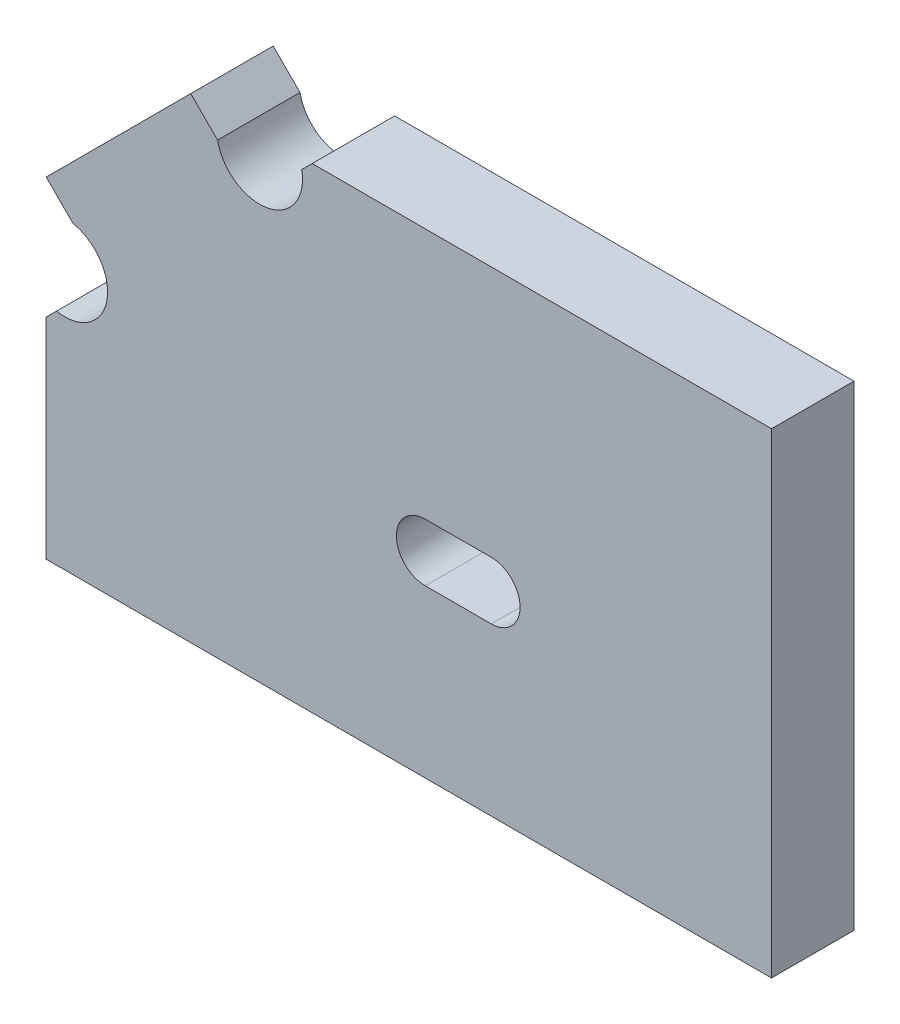
ISO-10303-21;
HEADER;
FILE_DESCRIPTION(('STEP AP214'),'2;1');
FILE_NAME('part.step','',(''),(''),'','','');
FILE_SCHEMA(('AUTOMOTIVE_DESIGN { 1 0 10303 214 1 1 1 1 }'));
ENDSEC;
DATA;
#1=APPLICATION_CONTEXT('core data for automotive mechanical design processes');
#2=APPLICATION_PROTOCOL_DEFINITION('international standard','automotive_design',2000,#1);
#3=PRODUCT_CONTEXT('',#1,'mechanical');
#4=PRODUCT('Part','Part','',(#3));
#5=PRODUCT_RELATED_PRODUCT_CATEGORY('part','',(#4));
#6=PRODUCT_DEFINITION_FORMATION('','',#4);
#7=PRODUCT_DEFINITION_CONTEXT('part definition',#1,'design');
#8=PRODUCT_DEFINITION('design','',#6,#7);
#9=PRODUCT_DEFINITION_SHAPE('','',#8);
#10=(LENGTH_UNIT() NAMED_UNIT(*) SI_UNIT(.MILLI.,.METRE.));
#11=(NAMED_UNIT(*) PLANE_ANGLE_UNIT() SI_UNIT($,.RADIAN.));
#12=(NAMED_UNIT(*) SI_UNIT($,.STERADIAN.) SOLID_ANGLE_UNIT());
#13=UNCERTAINTY_MEASURE_WITH_UNIT(LENGTH_MEASURE(1.E-05),#10,'distance_accuracy_value','');
#14=(GEOMETRIC_REPRESENTATION_CONTEXT(3) GLOBAL_UNCERTAINTY_ASSIGNED_CONTEXT((#13)) GLOBAL_UNIT_ASSIGNED_CONTEXT((#10,
#11,#12)) REPRESENTATION_CONTEXT('',''));
#15=CARTESIAN_POINT('',(0.,0.,0.));
#16=DIRECTION('',(0.,0.,1.));
#17=DIRECTION('',(1.,0.,0.));
#18=AXIS2_PLACEMENT_3D('',#15,#16,#17);
#19=CARTESIAN_POINT('',(-0.830126661656133,34.3741815202856,12.7));
#20=DIRECTION('',(0.707106781186547,-0.707106781186548,0.));
#21=DIRECTION('',(0.707106781186548,0.707106781186547,0.));
#22=AXIS2_PLACEMENT_3D('',#19,#20,#21);
#23=PLANE('',#22);
#24=DIRECTION('',(-0.707106781186548,-0.707106781186547,0.));
#25=VECTOR('',#24,1.);
#26=CARTESIAN_POINT('',(-0.830126661656133,34.3741815202856,0.));
#27=LINE('',#26,#25);
#28=CARTESIAN_POINT('',(-0.830126661656133,34.3741815202856,0.));
#29=VERTEX_POINT('',#28);
#30=CARTESIAN_POINT('',(-2.4402518098433,32.7640563720985,0.));
#31=VERTEX_POINT('',#30);
#32=EDGE_CURVE('E180',#29,#31,#27,.T.);
#33=ORIENTED_EDGE('',*,*,#32,.T.);
#34=DIRECTION('',(0.,0.,-1.));
#35=VECTOR('',#34,1.);
#36=CARTESIAN_POINT('',(-2.4402518098433,32.7640563720985,12.7));
#37=LINE('',#36,#35);
#38=CARTESIAN_POINT('',(-2.4402518098433,32.7640563720985,12.7));
#39=VERTEX_POINT('',#38);
#40=EDGE_CURVE('E11',#39,#31,#37,.T.);
#41=ORIENTED_EDGE('',*,*,#40,.F.);
#42=DIRECTION('',(-0.707106781186548,-0.707106781186547,0.));
#43=VECTOR('',#42,1.);
#44=CARTESIAN_POINT('',(-0.830126661656133,34.3741815202856,12.7));
#45=LINE('',#44,#43);
#46=CARTESIAN_POINT('',(-0.830126661656133,34.3741815202856,12.7));
#47=VERTEX_POINT('',#46);
#48=EDGE_CURVE('E184',#47,#39,#45,.T.);
#49=ORIENTED_EDGE('',*,*,#48,.F.);
#50=DIRECTION('',(0.,0.,-1.));
#51=VECTOR('',#50,1.);
#52=CARTESIAN_POINT('',(-0.830126661656133,34.3741815202856,12.7));
#53=LINE('',#52,#51);
#54=EDGE_CURVE('E208',#47,#29,#53,.T.);
#55=ORIENTED_EDGE('',*,*,#54,.T.);
#56=EDGE_LOOP('',(#33,#41,#49,#55));
#57=FACE_BOUND('',#56,.T.);
#58=ADVANCED_FACE('F41',(#57),#23,.F.);
#59=CARTESIAN_POINT('',(-8.92062767030955,31.4922290618523,12.7));
#60=DIRECTION('',(0.,0.,-1.));
#61=DIRECTION('',(-1.,0.,0.));
#62=AXIS2_PLACEMENT_3D('',#59,#60,#61);
#63=CYLINDRICAL_SURFACE('',#62,6.60400000000013);
#64=CARTESIAN_POINT('',(-8.92062767030955,31.4922290618523,0.));
#65=DIRECTION('',(0.,0.,-1.));
#66=DIRECTION('',(1.,0.,0.));
#67=AXIS2_PLACEMENT_3D('',#64,#65,#66);
#68=CIRCLE('',#67,6.60400000000013);
#69=CARTESIAN_POINT('',(-15.4010035307758,30.2204017516062,0.));
#70=VERTEX_POINT('',#69);
#71=EDGE_CURVE('E211',#31,#70,#68,.T.);
#72=ORIENTED_EDGE('',*,*,#71,.T.);
#73=DIRECTION('',(0.,0.,-1.));
#74=VECTOR('',#73,1.);
#75=CARTESIAN_POINT('',(-15.4010035307758,30.2204017516062,12.7));
#76=LINE('',#75,#74);
#77=CARTESIAN_POINT('',(-15.4010035307758,30.2204017516062,12.7));
#78=VERTEX_POINT('',#77);
#79=EDGE_CURVE('E48',#78,#70,#76,.T.);
#80=ORIENTED_EDGE('',*,*,#79,.F.);
#81=CARTESIAN_POINT('',(-8.92062767030955,31.4922290618523,12.7));
#82=DIRECTION('',(0.,0.,-1.));
#83=DIRECTION('',(1.,0.,0.));
#84=AXIS2_PLACEMENT_3D('',#81,#82,#83);
#85=CIRCLE('',#84,6.60400000000013);
#86=EDGE_CURVE('E187',#39,#78,#85,.T.);
#87=ORIENTED_EDGE('',*,*,#86,.F.);
#88=ORIENTED_EDGE('',*,*,#40,.T.);
#89=EDGE_LOOP('',(#72,#80,#87,#88));
#90=FACE_BOUND('',#89,.T.);
#91=ADVANCED_FACE('F281',(#90),#63,.F.);
#92=CARTESIAN_POINT('',(-19.5319213464676,34.351319567298,12.7));
#93=DIRECTION('',(-0.707106781186548,-0.707106781186547,0.));
#94=DIRECTION('',(0.707106781186547,-0.707106781186548,0.));
#95=AXIS2_PLACEMENT_3D('',#92,#93,#94);
#96=PLANE('',#95);
#97=DIRECTION('',(-0.707106781186547,0.707106781186548,0.));
#98=VECTOR('',#97,1.);
#99=CARTESIAN_POINT('',(-19.5319213464676,34.351319567298,0.));
#100=LINE('',#99,#98);
#101=CARTESIAN_POINT('',(-19.5319213464676,34.351319567298,0.));
#102=VERTEX_POINT('',#101);
#103=EDGE_CURVE('E213',#70,#102,#100,.T.);
#104=ORIENTED_EDGE('',*,*,#103,.T.);
#105=DIRECTION('',(0.,0.,-1.));
#106=VECTOR('',#105,1.);
#107=CARTESIAN_POINT('',(-19.5319213464676,34.351319567298,12.7));
#108=LINE('',#107,#106);
#109=CARTESIAN_POINT('',(-19.5319213464676,34.351319567298,12.7));
#110=VERTEX_POINT('',#109);
#111=EDGE_CURVE('E253',#110,#102,#108,.T.);
#112=ORIENTED_EDGE('',*,*,#111,.F.);
#113=DIRECTION('',(-0.707106781186547,0.707106781186548,0.));
#114=VECTOR('',#113,1.);
#115=CARTESIAN_POINT('',(-19.5319213464676,34.351319567298,12.7));
#116=LINE('',#115,#114);
#117=EDGE_CURVE('E190',#78,#110,#116,.T.);
#118=ORIENTED_EDGE('',*,*,#117,.F.);
#119=ORIENTED_EDGE('',*,*,#79,.T.);
#120=EDGE_LOOP('',(#104,#112,#118,#119));
#121=FACE_BOUND('',#120,.T.);
#122=ADVANCED_FACE('F260',(#121),#96,.F.);
#123=CARTESIAN_POINT('',(-19.5319213464676,34.351319567298,12.7));
#124=DIRECTION('',(0.707106781186546,-0.707106781186549,0.));
#125=DIRECTION('',(0.707106781186549,0.707106781186546,0.));
#126=AXIS2_PLACEMENT_3D('',#123,#124,#125);
#127=PLANE('',#126);
#128=DIRECTION('',(-0.707106781186549,-0.707106781186546,0.));
#129=VECTOR('',#128,1.);
#130=CARTESIAN_POINT('',(-19.5319213464676,34.351319567298,0.));
#131=LINE('',#130,#129);
#132=CARTESIAN_POINT('',(-41.8029565267192,12.0802843870466,0.));
#133=VERTEX_POINT('',#132);
#134=EDGE_CURVE('E215',#102,#133,#131,.T.);
#135=ORIENTED_EDGE('',*,*,#134,.T.);
#136=DIRECTION('',(0.,0.,-1.));
#137=VECTOR('',#136,1.);
#138=CARTESIAN_POINT('',(-41.8029565267192,12.0802843870466,12.7));
#139=LINE('',#138,#137);
#140=CARTESIAN_POINT('',(-41.8029565267192,12.0802843870466,12.7));
#141=VERTEX_POINT('',#140);
#142=EDGE_CURVE('E250',#141,#133,#139,.T.);
#143=ORIENTED_EDGE('',*,*,#142,.F.);
#144=DIRECTION('',(-0.707106781186549,-0.707106781186546,0.));
#145=VECTOR('',#144,1.);
#146=CARTESIAN_POINT('',(-19.5319213464676,34.351319567298,12.7));
#147=LINE('',#146,#145);
#148=EDGE_CURVE('E192',#110,#141,#147,.T.);
#149=ORIENTED_EDGE('',*,*,#148,.F.);
#150=ORIENTED_EDGE('',*,*,#111,.T.);
#151=EDGE_LOOP('',(#135,#143,#149,#150));
#152=FACE_BOUND('',#151,.T.);
#153=ADVANCED_FACE('F271',(#152),#127,.F.);
#154=CARTESIAN_POINT('',(-41.8029565267192,12.0802843870466,12.7));
#155=DIRECTION('',(0.707106781186548,0.707106781186547,0.));
#156=DIRECTION('',(-0.707106781186547,0.707106781186548,0.));
#157=AXIS2_PLACEMENT_3D('',#154,#155,#156);
#158=PLANE('',#157);
#159=DIRECTION('',(0.707106781186547,-0.707106781186548,0.));
#160=VECTOR('',#159,1.);
#161=CARTESIAN_POINT('',(-41.8029565267192,12.0802843870466,0.));
#162=LINE('',#161,#160);
#163=CARTESIAN_POINT('',(-37.6720387110273,7.94936657135473,0.));
#164=VERTEX_POINT('',#163);
#165=EDGE_CURVE('E217',#133,#164,#162,.T.);
#166=ORIENTED_EDGE('',*,*,#165,.T.);
#167=DIRECTION('',(0.,0.,-1.));
#168=VECTOR('',#167,1.);
#169=CARTESIAN_POINT('',(-37.6720387110273,7.94936657135473,12.7));
#170=LINE('',#169,#168);
#171=CARTESIAN_POINT('',(-37.6720387110273,7.94936657135473,12.7));
#172=VERTEX_POINT('',#171);
#173=EDGE_CURVE('E247',#172,#164,#170,.T.);
#174=ORIENTED_EDGE('',*,*,#173,.F.);
#175=DIRECTION('',(0.707106781186547,-0.707106781186548,0.));
#176=VECTOR('',#175,1.);
#177=CARTESIAN_POINT('',(-41.8029565267192,12.0802843870466,12.7));
#178=LINE('',#177,#176);
#179=EDGE_CURVE('E194',#141,#172,#178,.T.);
#180=ORIENTED_EDGE('',*,*,#179,.F.);
#181=ORIENTED_EDGE('',*,*,#142,.T.);
#182=EDGE_LOOP('',(#166,#174,#180,#181));
#183=FACE_BOUND('',#182,.T.);
#184=ADVANCED_FACE('F275',(#183),#158,.F.);
#185=CARTESIAN_POINT('',(-38.9438660212735,1.46899071088847,12.7));
#186=DIRECTION('',(0.,0.,-1.));
#187=DIRECTION('',(-1.,0.,0.));
#188=AXIS2_PLACEMENT_3D('',#185,#186,#187);
#189=CYLINDRICAL_SURFACE('',#188,6.60400000000014);
#190=CARTESIAN_POINT('',(-38.9438660212735,1.46899071088847,0.));
#191=DIRECTION('',(0.,0.,-1.));
#192=DIRECTION('',(-1.,0.,0.));
#193=AXIS2_PLACEMENT_3D('',#190,#191,#192);
#194=CIRCLE('',#193,6.60400000000014);
#195=CARTESIAN_POINT('',(-40.2156933315197,-5.01138514957778,0.));
#196=VERTEX_POINT('',#195);
#197=EDGE_CURVE('E219',#164,#196,#194,.T.);
#198=ORIENTED_EDGE('',*,*,#197,.T.);
#199=DIRECTION('',(0.,0.,-1.));
#200=VECTOR('',#199,1.);
#201=CARTESIAN_POINT('',(-40.2156933315197,-5.01138514957778,12.7));
#202=LINE('',#201,#200);
#203=CARTESIAN_POINT('',(-40.2156933315197,-5.01138514957778,12.7));
#204=VERTEX_POINT('',#203);
#205=EDGE_CURVE('E244',#204,#196,#202,.T.);
#206=ORIENTED_EDGE('',*,*,#205,.F.);
#207=CARTESIAN_POINT('',(-38.9438660212735,1.46899071088847,12.7));
#208=DIRECTION('',(0.,0.,-1.));
#209=DIRECTION('',(-1.,0.,0.));
#210=AXIS2_PLACEMENT_3D('',#207,#208,#209);
#211=CIRCLE('',#210,6.60400000000014);
#212=EDGE_CURVE('E196',#172,#204,#211,.T.);
#213=ORIENTED_EDGE('',*,*,#212,.F.);
#214=ORIENTED_EDGE('',*,*,#173,.T.);
#215=EDGE_LOOP('',(#198,#206,#213,#214));
#216=FACE_BOUND('',#215,.T.);
#217=ADVANCED_FACE('F309',(#216),#189,.F.);
#218=CARTESIAN_POINT('',(-40.2156933315197,-5.01138514957778,12.7));
#219=DIRECTION('',(0.707106781186546,-0.707106781186549,0.));
#220=DIRECTION('',(0.707106781186549,0.707106781186546,0.));
#221=AXIS2_PLACEMENT_3D('',#218,#219,#220);
#222=PLANE('',#221);
#223=DIRECTION('',(-0.707106781186549,-0.707106781186546,0.));
#224=VECTOR('',#223,1.);
#225=CARTESIAN_POINT('',(-40.2156933315197,-5.01138514957778,0.));
#226=LINE('',#225,#224);
#227=CARTESIAN_POINT('',(-41.8258184797068,-6.62151029776494,0.));
#228=VERTEX_POINT('',#227);
#229=EDGE_CURVE('E221',#196,#228,#226,.T.);
#230=ORIENTED_EDGE('',*,*,#229,.T.);
#231=DIRECTION('',(0.,0.,-1.));
#232=VECTOR('',#231,1.);
#233=CARTESIAN_POINT('',(-41.8258184797068,-6.62151029776494,12.7));
#234=LINE('',#233,#232);
#235=CARTESIAN_POINT('',(-41.8258184797068,-6.62151029776494,12.7));
#236=VERTEX_POINT('',#235);
#237=EDGE_CURVE('E241',#236,#228,#234,.T.);
#238=ORIENTED_EDGE('',*,*,#237,.F.);
#239=DIRECTION('',(-0.707106781186549,-0.707106781186546,0.));
#240=VECTOR('',#239,1.);
#241=CARTESIAN_POINT('',(-40.2156933315197,-5.01138514957778,12.7));
#242=LINE('',#241,#240);
#243=EDGE_CURVE('E198',#204,#236,#242,.T.);
#244=ORIENTED_EDGE('',*,*,#243,.F.);
#245=ORIENTED_EDGE('',*,*,#205,.T.);
#246=EDGE_LOOP('',(#230,#238,#244,#245));
#247=FACE_BOUND('',#246,.T.);
#248=ADVANCED_FACE('F307',(#247),#222,.F.);
#249=CARTESIAN_POINT('',(-41.8258184797068,-6.62151029776494,12.7));
#250=DIRECTION('',(1.,0.,0.));
#251=DIRECTION('',(0.,0.,-1.));
#252=AXIS2_PLACEMENT_3D('',#249,#250,#251);
#253=PLANE('',#252);
#254=DIRECTION('',(0.,-1.,0.));
#255=VECTOR('',#254,1.);
#256=CARTESIAN_POINT('',(-41.8258184797068,-6.62151029776494,0.));
#257=LINE('',#256,#255);
#258=CARTESIAN_POINT('',(-41.8258184797068,-38.9048184797143,0.));
#259=VERTEX_POINT('',#258);
#260=EDGE_CURVE('E223',#228,#259,#257,.T.);
#261=ORIENTED_EDGE('',*,*,#260,.T.);
#262=DIRECTION('',(0.,0.,-1.));
#263=VECTOR('',#262,1.);
#264=CARTESIAN_POINT('',(-41.8258184797068,-38.9048184797143,12.7));
#265=LINE('',#264,#263);
#266=CARTESIAN_POINT('',(-41.8258184797068,-38.9048184797143,12.7));
#267=VERTEX_POINT('',#266);
#268=EDGE_CURVE('E238',#267,#259,#265,.T.);
#269=ORIENTED_EDGE('',*,*,#268,.F.);
#270=DIRECTION('',(0.,-1.,0.));
#271=VECTOR('',#270,1.);
#272=CARTESIAN_POINT('',(-41.8258184797068,-6.62151029776494,12.7));
#273=LINE('',#272,#271);
#274=EDGE_CURVE('E200',#236,#267,#273,.T.);
#275=ORIENTED_EDGE('',*,*,#274,.F.);
#276=ORIENTED_EDGE('',*,*,#237,.T.);
#277=EDGE_LOOP('',(#261,#269,#275,#276));
#278=FACE_BOUND('',#277,.T.);
#279=ADVANCED_FACE('F302',(#278),#253,.F.);
#280=CARTESIAN_POINT('',(-41.8258184797068,-38.9048184797143,12.7));
#281=DIRECTION('',(0.,1.,0.));
#282=DIRECTION('',(-1.,0.,0.));
#283=AXIS2_PLACEMENT_3D('',#280,#281,#282);
#284=PLANE('',#283);
#285=DIRECTION('',(1.,0.,0.));
#286=VECTOR('',#285,1.);
#287=CARTESIAN_POINT('',(-41.8258184797068,-38.9048184797143,0.));
#288=LINE('',#287,#286);
#289=CARTESIAN_POINT('',(69.9341815202932,-38.9048184797143,0.));
#290=VERTEX_POINT('',#289);
#291=EDGE_CURVE('E225',#259,#290,#288,.T.);
#292=ORIENTED_EDGE('',*,*,#291,.T.);
#293=DIRECTION('',(0.,0.,-1.));
#294=VECTOR('',#293,1.);
#295=CARTESIAN_POINT('',(69.9341815202932,-38.9048184797143,12.7));
#296=LINE('',#295,#294);
#297=CARTESIAN_POINT('',(69.9341815202932,-38.9048184797143,12.7));
#298=VERTEX_POINT('',#297);
#299=EDGE_CURVE('E235',#298,#290,#296,.T.);
#300=ORIENTED_EDGE('',*,*,#299,.F.);
#301=DIRECTION('',(1.,0.,0.));
#302=VECTOR('',#301,1.);
#303=CARTESIAN_POINT('',(-41.8258184797068,-38.9048184797143,12.7));
#304=LINE('',#303,#302);
#305=EDGE_CURVE('E202',#267,#298,#304,.T.);
#306=ORIENTED_EDGE('',*,*,#305,.F.);
#307=ORIENTED_EDGE('',*,*,#268,.T.);
#308=EDGE_LOOP('',(#292,#300,#306,#307));
#309=FACE_BOUND('',#308,.T.);
#310=ADVANCED_FACE('F297',(#309),#284,.F.);
#311=CARTESIAN_POINT('',(69.9341815202932,34.3741815202856,12.7));
#312=DIRECTION('',(-1.,0.,0.));
#313=DIRECTION('',(0.,-1.,0.));
#314=AXIS2_PLACEMENT_3D('',#311,#312,#313);
#315=PLANE('',#314);
#316=DIRECTION('',(0.,1.,0.));
#317=VECTOR('',#316,1.);
#318=CARTESIAN_POINT('',(69.9341815202932,34.3741815202856,0.));
#319=LINE('',#318,#317);
#320=CARTESIAN_POINT('',(69.9341815202932,34.3741815202856,0.));
#321=VERTEX_POINT('',#320);
#322=EDGE_CURVE('E227',#290,#321,#319,.T.);
#323=ORIENTED_EDGE('',*,*,#322,.T.);
#324=DIRECTION('',(0.,0.,-1.));
#325=VECTOR('',#324,1.);
#326=CARTESIAN_POINT('',(69.9341815202932,34.3741815202856,12.7));
#327=LINE('',#326,#325);
#328=CARTESIAN_POINT('',(69.9341815202932,34.3741815202856,12.7));
#329=VERTEX_POINT('',#328);
#330=EDGE_CURVE('E232',#329,#321,#327,.T.);
#331=ORIENTED_EDGE('',*,*,#330,.F.);
#332=DIRECTION('',(0.,1.,0.));
#333=VECTOR('',#332,1.);
#334=CARTESIAN_POINT('',(69.9341815202932,34.3741815202856,12.7));
#335=LINE('',#334,#333);
#336=EDGE_CURVE('E204',#298,#329,#335,.T.);
#337=ORIENTED_EDGE('',*,*,#336,.F.);
#338=ORIENTED_EDGE('',*,*,#299,.T.);
#339=EDGE_LOOP('',(#323,#331,#337,#338));
#340=FACE_BOUND('',#339,.T.);
#341=ADVANCED_FACE('F293',(#340),#315,.F.);
#342=CARTESIAN_POINT('',(-0.830126661656133,34.3741815202856,12.7));
#343=DIRECTION('',(0.,-1.,0.));
#344=DIRECTION('',(0.,0.,-1.));
#345=AXIS2_PLACEMENT_3D('',#342,#343,#344);
#346=PLANE('',#345);
#347=DIRECTION('',(-1.,0.,0.));
#348=VECTOR('',#347,1.);
#349=CARTESIAN_POINT('',(-0.830126661656133,34.3741815202856,0.));
#350=LINE('',#349,#348);
#351=EDGE_CURVE('E188',#321,#29,#350,.T.);
#352=ORIENTED_EDGE('',*,*,#351,.T.);
#353=ORIENTED_EDGE('',*,*,#54,.F.);
#354=DIRECTION('',(-1.,0.,0.));
#355=VECTOR('',#354,1.);
#356=CARTESIAN_POINT('',(-0.830126661656133,34.3741815202856,12.7));
#357=LINE('',#356,#355);
#358=EDGE_CURVE('E206',#329,#47,#357,.T.);
#359=ORIENTED_EDGE('',*,*,#358,.F.);
#360=ORIENTED_EDGE('',*,*,#330,.T.);
#361=EDGE_LOOP('',(#352,#353,#359,#360));
#362=FACE_BOUND('',#361,.T.);
#363=ADVANCED_FACE('F288',(#362),#346,.F.);
#364=CARTESIAN_POINT('',(-8.92062767030955,31.4922290618523,12.7));
#365=DIRECTION('',(0.,0.,1.));
#366=DIRECTION('',(1.,0.,0.));
#367=AXIS2_PLACEMENT_3D('',#364,#365,#366);
#368=PLANE('',#367);
#369=CARTESIAN_POINT('',(26.7541815202932,-8.80581847971439,12.7));
#370=DIRECTION('',(0.,0.,-1.));
#371=DIRECTION('',(-1.,0.,0.));
#372=AXIS2_PLACEMENT_3D('',#369,#370,#371);
#373=CIRCLE('',#372,4.445);
#374=CARTESIAN_POINT('',(26.7541815202932,-4.36081847971439,12.7));
#375=VERTEX_POINT('',#374);
#376=CARTESIAN_POINT('',(26.7541815202932,-13.2508184797144,12.7));
#377=VERTEX_POINT('',#376);
#378=EDGE_CURVE('E149',#375,#377,#373,.T.);
#379=ORIENTED_EDGE('',*,*,#378,.T.);
#380=DIRECTION('',(-1.,0.,0.));
#381=VECTOR('',#380,1.);
#382=CARTESIAN_POINT('',(26.7541815202932,-13.2508184797144,12.7));
#383=LINE('',#382,#381);
#384=CARTESIAN_POINT('',(16.5941815202932,-13.2508184797144,12.7));
#385=VERTEX_POINT('',#384);
#386=EDGE_CURVE('E158',#377,#385,#383,.T.);
#387=ORIENTED_EDGE('',*,*,#386,.T.);
#388=CARTESIAN_POINT('',(16.5941815202932,-8.80581847971439,12.7));
#389=DIRECTION('',(0.,0.,-1.));
#390=DIRECTION('',(-1.,0.,0.));
#391=AXIS2_PLACEMENT_3D('',#388,#389,#390);
#392=CIRCLE('',#391,4.445);
#393=CARTESIAN_POINT('',(16.5941815202932,-4.36081847971439,12.7));
#394=VERTEX_POINT('',#393);
#395=EDGE_CURVE('E55',#385,#394,#392,.T.);
#396=ORIENTED_EDGE('',*,*,#395,.T.);
#397=DIRECTION('',(1.,0.,0.));
#398=VECTOR('',#397,1.);
#399=CARTESIAN_POINT('',(26.7541815202932,-4.36081847971439,12.7));
#400=LINE('',#399,#398);
#401=EDGE_CURVE('E155',#394,#375,#400,.T.);
#402=ORIENTED_EDGE('',*,*,#401,.T.);
#403=EDGE_LOOP('',(#379,#387,#396,#402));
#404=FACE_BOUND('',#403,.T.);
#405=ORIENTED_EDGE('',*,*,#48,.T.);
#406=ORIENTED_EDGE('',*,*,#86,.T.);
#407=ORIENTED_EDGE('',*,*,#117,.T.);
#408=ORIENTED_EDGE('',*,*,#148,.T.);
#409=ORIENTED_EDGE('',*,*,#179,.T.);
#410=ORIENTED_EDGE('',*,*,#212,.T.);
#411=ORIENTED_EDGE('',*,*,#243,.T.);
#412=ORIENTED_EDGE('',*,*,#274,.T.);
#413=ORIENTED_EDGE('',*,*,#305,.T.);
#414=ORIENTED_EDGE('',*,*,#336,.T.);
#415=ORIENTED_EDGE('',*,*,#358,.T.);
#416=EDGE_LOOP('',(#405,#406,#407,#408,#409,#410,#411,#412,#413,#414,#415));
#417=FACE_BOUND('',#416,.T.);
#418=ADVANCED_FACE('F162',(#404,#417),#368,.T.);
#419=CARTESIAN_POINT('',(-8.92062767030955,31.4922290618523,0.));
#420=DIRECTION('',(0.,0.,1.));
#421=DIRECTION('',(1.,0.,0.));
#422=AXIS2_PLACEMENT_3D('',#419,#420,#421);
#423=PLANE('',#422);
#424=DIRECTION('',(-1.,0.,0.));
#425=VECTOR('',#424,1.);
#426=CARTESIAN_POINT('',(26.7541815202932,-13.2508184797144,0.));
#427=LINE('',#426,#425);
#428=CARTESIAN_POINT('',(26.7541815202932,-13.2508184797144,0.));
#429=VERTEX_POINT('',#428);
#430=CARTESIAN_POINT('',(16.5941815202932,-13.2508184797144,0.));
#431=VERTEX_POINT('',#430);
#432=EDGE_CURVE('E174',#429,#431,#427,.T.);
#433=ORIENTED_EDGE('',*,*,#432,.F.);
#434=CARTESIAN_POINT('',(26.7541815202932,-8.80581847971439,0.));
#435=DIRECTION('',(0.,0.,-1.));
#436=DIRECTION('',(-1.,0.,0.));
#437=AXIS2_PLACEMENT_3D('',#434,#435,#436);
#438=CIRCLE('',#437,4.445);
#439=CARTESIAN_POINT('',(26.7541815202932,-4.36081847971439,0.));
#440=VERTEX_POINT('',#439);
#441=EDGE_CURVE('E63',#440,#429,#438,.T.);
#442=ORIENTED_EDGE('',*,*,#441,.F.);
#443=DIRECTION('',(1.,0.,0.));
#444=VECTOR('',#443,1.);
#445=CARTESIAN_POINT('',(26.7541815202932,-4.36081847971439,0.));
#446=LINE('',#445,#444);
#447=CARTESIAN_POINT('',(16.5941815202932,-4.36081847971439,0.));
#448=VERTEX_POINT('',#447);
#449=EDGE_CURVE('E165',#448,#440,#446,.T.);
#450=ORIENTED_EDGE('',*,*,#449,.F.);
#451=CARTESIAN_POINT('',(16.5941815202932,-8.80581847971439,0.));
#452=DIRECTION('',(0.,0.,-1.));
#453=DIRECTION('',(-1.,0.,0.));
#454=AXIS2_PLACEMENT_3D('',#451,#452,#453);
#455=CIRCLE('',#454,4.445);
#456=EDGE_CURVE('E168',#431,#448,#455,.T.);
#457=ORIENTED_EDGE('',*,*,#456,.F.);
#458=EDGE_LOOP('',(#433,#442,#450,#457));
#459=FACE_BOUND('',#458,.T.);
#460=ORIENTED_EDGE('',*,*,#32,.F.);
#461=ORIENTED_EDGE('',*,*,#351,.F.);
#462=ORIENTED_EDGE('',*,*,#322,.F.);
#463=ORIENTED_EDGE('',*,*,#291,.F.);
#464=ORIENTED_EDGE('',*,*,#260,.F.);
#465=ORIENTED_EDGE('',*,*,#229,.F.);
#466=ORIENTED_EDGE('',*,*,#197,.F.);
#467=ORIENTED_EDGE('',*,*,#165,.F.);
#468=ORIENTED_EDGE('',*,*,#134,.F.);
#469=ORIENTED_EDGE('',*,*,#103,.F.);
#470=ORIENTED_EDGE('',*,*,#71,.F.);
#471=EDGE_LOOP('',(#460,#461,#462,#463,#464,#465,#466,#467,#468,#469,#470));
#472=FACE_BOUND('',#471,.T.);
#473=ADVANCED_FACE('F266',(#459,#472),#423,.F.);
#474=CARTESIAN_POINT('',(26.7541815202932,-8.80581847971439,12.7));
#475=DIRECTION('',(0.,0.,-1.));
#476=DIRECTION('',(-1.,0.,0.));
#477=AXIS2_PLACEMENT_3D('',#474,#475,#476);
#478=CYLINDRICAL_SURFACE('',#477,4.445);
#479=ORIENTED_EDGE('',*,*,#441,.T.);
#480=DIRECTION('',(0.,0.,-1.));
#481=VECTOR('',#480,1.);
#482=CARTESIAN_POINT('',(26.7541815202932,-13.2508184797144,12.7));
#483=LINE('',#482,#481);
#484=EDGE_CURVE('E145',#377,#429,#483,.T.);
#485=ORIENTED_EDGE('',*,*,#484,.F.);
#486=ORIENTED_EDGE('',*,*,#378,.F.);
#487=DIRECTION('',(0.,0.,-1.));
#488=VECTOR('',#487,1.);
#489=CARTESIAN_POINT('',(26.7541815202932,-4.36081847971439,12.7));
#490=LINE('',#489,#488);
#491=EDGE_CURVE('E178',#375,#440,#490,.T.);
#492=ORIENTED_EDGE('',*,*,#491,.T.);
#493=EDGE_LOOP('',(#479,#485,#486,#492));
#494=FACE_BOUND('',#493,.T.);
#495=ADVANCED_FACE('F147',(#494),#478,.F.);
#496=CARTESIAN_POINT('',(26.7541815202932,-4.36081847971439,12.7));
#497=DIRECTION('',(0.,1.,0.));
#498=DIRECTION('',(0.,0.,1.));
#499=AXIS2_PLACEMENT_3D('',#496,#497,#498);
#500=PLANE('',#499);
#501=ORIENTED_EDGE('',*,*,#449,.T.);
#502=ORIENTED_EDGE('',*,*,#491,.F.);
#503=ORIENTED_EDGE('',*,*,#401,.F.);
#504=DIRECTION('',(0.,0.,-1.));
#505=VECTOR('',#504,1.);
#506=CARTESIAN_POINT('',(16.5941815202932,-4.36081847971439,12.7));
#507=LINE('',#506,#505);
#508=EDGE_CURVE('E181',#394,#448,#507,.T.);
#509=ORIENTED_EDGE('',*,*,#508,.T.);
#510=EDGE_LOOP('',(#501,#502,#503,#509));
#511=FACE_BOUND('',#510,.T.);
#512=ADVANCED_FACE('F406',(#511),#500,.F.);
#513=CARTESIAN_POINT('',(16.5941815202932,-8.80581847971439,12.7));
#514=DIRECTION('',(0.,0.,-1.));
#515=DIRECTION('',(-1.,0.,0.));
#516=AXIS2_PLACEMENT_3D('',#513,#514,#515);
#517=CYLINDRICAL_SURFACE('',#516,4.445);
#518=ORIENTED_EDGE('',*,*,#456,.T.);
#519=ORIENTED_EDGE('',*,*,#508,.F.);
#520=ORIENTED_EDGE('',*,*,#395,.F.);
#521=DIRECTION('',(0.,0.,-1.));
#522=VECTOR('',#521,1.);
#523=CARTESIAN_POINT('',(16.5941815202932,-13.2508184797144,12.7));
#524=LINE('',#523,#522);
#525=EDGE_CURVE('E154',#385,#431,#524,.T.);
#526=ORIENTED_EDGE('',*,*,#525,.T.);
#527=EDGE_LOOP('',(#518,#519,#520,#526));
#528=FACE_BOUND('',#527,.T.);
#529=ADVANCED_FACE('F415',(#528),#517,.F.);
#530=CARTESIAN_POINT('',(26.7541815202932,-13.2508184797144,12.7));
#531=DIRECTION('',(0.,-1.,0.));
#532=DIRECTION('',(0.,0.,-1.));
#533=AXIS2_PLACEMENT_3D('',#530,#531,#532);
#534=PLANE('',#533);
#535=ORIENTED_EDGE('',*,*,#432,.T.);
#536=ORIENTED_EDGE('',*,*,#525,.F.);
#537=ORIENTED_EDGE('',*,*,#386,.F.);
#538=ORIENTED_EDGE('',*,*,#484,.T.);
#539=EDGE_LOOP('',(#535,#536,#537,#538));
#540=FACE_BOUND('',#539,.T.);
#541=ADVANCED_FACE('F159',(#540),#534,.F.);
#542=CLOSED_SHELL('',(#58,#91,#122,#153,#184,#217,#248,#279,#310,#341,#363,#418,#473,#495,#512,
#529,#541));
#543=MANIFOLD_SOLID_BREP('B2',#542);
#544=ADVANCED_BREP_SHAPE_REPRESENTATION('',(#18,#543),#14);
#545=SHAPE_DEFINITION_REPRESENTATION(#9,#544);
ENDSEC;
END-ISO-10303-21;
